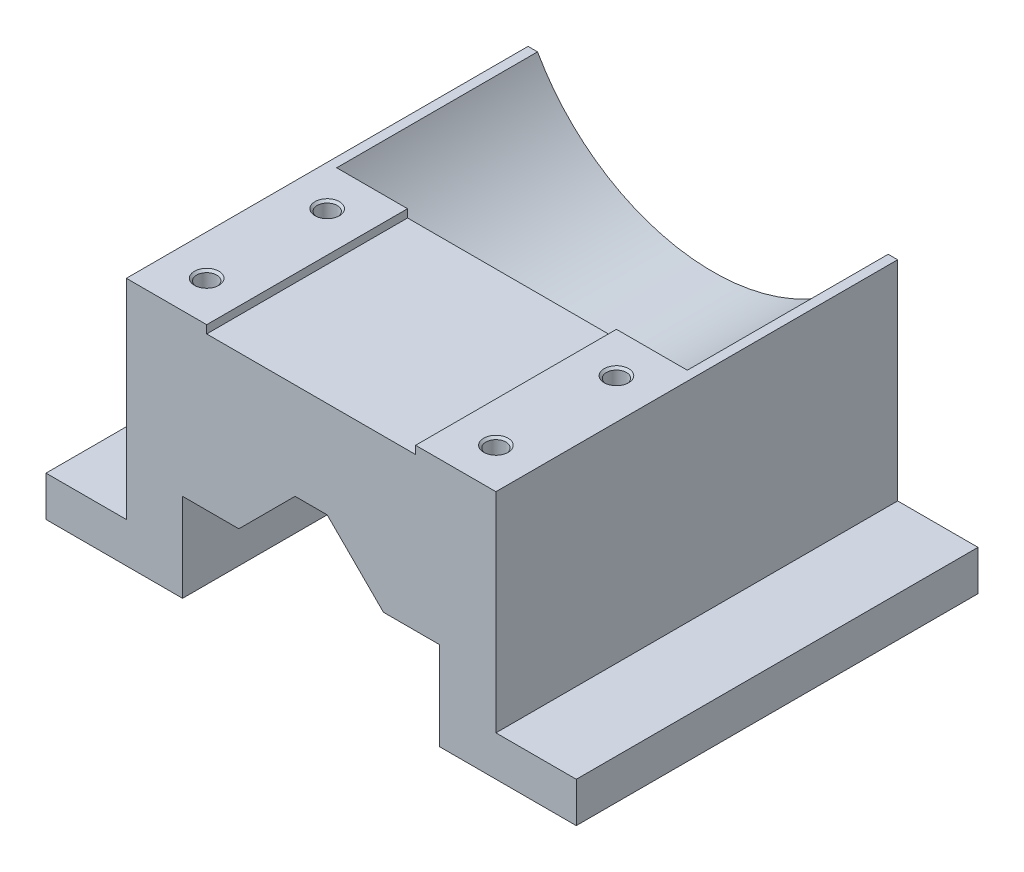
ISO-10303-21;
HEADER;
FILE_DESCRIPTION(('STEP AP214'),'2;1');
FILE_NAME('part.step','',(''),(''),'','','');
FILE_SCHEMA(('AUTOMOTIVE_DESIGN { 1 0 10303 214 1 1 1 1 }'));
ENDSEC;
DATA;
#1=APPLICATION_CONTEXT('core data for automotive mechanical design processes');
#2=APPLICATION_PROTOCOL_DEFINITION('international standard','automotive_design',2000,#1);
#3=PRODUCT_CONTEXT('',#1,'mechanical');
#4=PRODUCT('Part','Part','',(#3));
#5=PRODUCT_RELATED_PRODUCT_CATEGORY('part','',(#4));
#6=PRODUCT_DEFINITION_FORMATION('','',#4);
#7=PRODUCT_DEFINITION_CONTEXT('part definition',#1,'design');
#8=PRODUCT_DEFINITION('design','',#6,#7);
#9=PRODUCT_DEFINITION_SHAPE('','',#8);
#10=(LENGTH_UNIT() NAMED_UNIT(*) SI_UNIT(.MILLI.,.METRE.));
#11=(NAMED_UNIT(*) PLANE_ANGLE_UNIT() SI_UNIT($,.RADIAN.));
#12=(NAMED_UNIT(*) SI_UNIT($,.STERADIAN.) SOLID_ANGLE_UNIT());
#13=UNCERTAINTY_MEASURE_WITH_UNIT(LENGTH_MEASURE(1.E-05),#10,'distance_accuracy_value','');
#14=(GEOMETRIC_REPRESENTATION_CONTEXT(3) GLOBAL_UNCERTAINTY_ASSIGNED_CONTEXT((#13)) GLOBAL_UNIT_ASSIGNED_CONTEXT((#10,
#11,#12)) REPRESENTATION_CONTEXT('',''));
#15=CARTESIAN_POINT('',(0.,0.,0.));
#16=DIRECTION('',(0.,0.,1.));
#17=DIRECTION('',(1.,0.,0.));
#18=AXIS2_PLACEMENT_3D('',#15,#16,#17);
#19=CARTESIAN_POINT('',(-13.,0.,50.));
#20=DIRECTION('',(-1.,0.,0.));
#21=DIRECTION('',(0.,0.,1.));
#22=AXIS2_PLACEMENT_3D('',#19,#20,#21);
#23=PLANE('',#22);
#24=DIRECTION('',(0.,-1.,0.));
#25=VECTOR('',#24,1.);
#26=CARTESIAN_POINT('',(-13.,0.,25.));
#27=LINE('',#26,#25);
#28=CARTESIAN_POINT('',(-13.,1.,25.));
#29=VERTEX_POINT('',#28);
#30=CARTESIAN_POINT('',(-13.,0.,25.));
#31=VERTEX_POINT('',#30);
#32=EDGE_CURVE('E349',#29,#31,#27,.T.);
#33=ORIENTED_EDGE('',*,*,#32,.F.);
#34=DIRECTION('',(0.,0.,-1.));
#35=VECTOR('',#34,1.);
#36=CARTESIAN_POINT('',(-13.,1.,50.));
#37=LINE('',#36,#35);
#38=CARTESIAN_POINT('',(-13.,1.,50.));
#39=VERTEX_POINT('',#38);
#40=EDGE_CURVE('E53',#39,#29,#37,.T.);
#41=ORIENTED_EDGE('',*,*,#40,.F.);
#42=DIRECTION('',(0.,1.,0.));
#43=VECTOR('',#42,1.);
#44=CARTESIAN_POINT('',(-13.,0.,50.));
#45=LINE('',#44,#43);
#46=CARTESIAN_POINT('',(-13.,0.,50.));
#47=VERTEX_POINT('',#46);
#48=EDGE_CURVE('E272',#47,#39,#45,.T.);
#49=ORIENTED_EDGE('',*,*,#48,.F.);
#50=DIRECTION('',(0.,0.,-1.));
#51=VECTOR('',#50,1.);
#52=CARTESIAN_POINT('',(-13.,0.,50.));
#53=LINE('',#52,#51);
#54=EDGE_CURVE('E217',#47,#31,#53,.T.);
#55=ORIENTED_EDGE('',*,*,#54,.T.);
#56=EDGE_LOOP('',(#33,#41,#49,#55));
#57=FACE_BOUND('',#56,.T.);
#58=ADVANCED_FACE('F45',(#57),#23,.F.);
#59=CARTESIAN_POINT('',(13.,0.,50.));
#60=DIRECTION('',(1.,0.,0.));
#61=DIRECTION('',(0.,0.,-1.));
#62=AXIS2_PLACEMENT_3D('',#59,#60,#61);
#63=PLANE('',#62);
#64=DIRECTION('',(0.,1.,0.));
#65=VECTOR('',#64,1.);
#66=CARTESIAN_POINT('',(13.,0.,25.));
#67=LINE('',#66,#65);
#68=CARTESIAN_POINT('',(13.,0.,25.));
#69=VERTEX_POINT('',#68);
#70=CARTESIAN_POINT('',(13.,1.,25.));
#71=VERTEX_POINT('',#70);
#72=EDGE_CURVE('E358',#69,#71,#67,.T.);
#73=ORIENTED_EDGE('',*,*,#72,.F.);
#74=DIRECTION('',(0.,0.,-1.));
#75=VECTOR('',#74,1.);
#76=CARTESIAN_POINT('',(13.,0.,50.));
#77=LINE('',#76,#75);
#78=CARTESIAN_POINT('',(13.,0.,50.));
#79=VERTEX_POINT('',#78);
#80=EDGE_CURVE('E210',#79,#69,#77,.T.);
#81=ORIENTED_EDGE('',*,*,#80,.F.);
#82=DIRECTION('',(0.,-1.,0.));
#83=VECTOR('',#82,1.);
#84=CARTESIAN_POINT('',(13.,0.,50.));
#85=LINE('',#84,#83);
#86=CARTESIAN_POINT('',(13.,1.,50.));
#87=VERTEX_POINT('',#86);
#88=EDGE_CURVE('E191',#87,#79,#85,.T.);
#89=ORIENTED_EDGE('',*,*,#88,.F.);
#90=DIRECTION('',(0.,0.,-1.));
#91=VECTOR('',#90,1.);
#92=CARTESIAN_POINT('',(13.,1.,50.));
#93=LINE('',#92,#91);
#94=EDGE_CURVE('E200',#87,#71,#93,.T.);
#95=ORIENTED_EDGE('',*,*,#94,.T.);
#96=EDGE_LOOP('',(#73,#81,#89,#95));
#97=FACE_BOUND('',#96,.T.);
#98=ADVANCED_FACE('F212',(#97),#63,.F.);
#99=CARTESIAN_POINT('',(-13.,0.,50.));
#100=DIRECTION('',(0.,-1.,0.));
#101=DIRECTION('',(1.,0.,0.));
#102=AXIS2_PLACEMENT_3D('',#99,#100,#101);
#103=PLANE('',#102);
#104=DIRECTION('',(1.,0.,0.));
#105=VECTOR('',#104,1.);
#106=CARTESIAN_POINT('',(-13.,0.,25.));
#107=LINE('',#106,#105);
#108=EDGE_CURVE('E11',#31,#69,#107,.T.);
#109=ORIENTED_EDGE('',*,*,#108,.F.);
#110=ORIENTED_EDGE('',*,*,#54,.F.);
#111=DIRECTION('',(-1.,0.,0.));
#112=VECTOR('',#111,1.);
#113=CARTESIAN_POINT('',(-13.,0.,50.));
#114=LINE('',#113,#112);
#115=EDGE_CURVE('E69',#79,#47,#114,.T.);
#116=ORIENTED_EDGE('',*,*,#115,.F.);
#117=ORIENTED_EDGE('',*,*,#80,.T.);
#118=EDGE_LOOP('',(#109,#110,#116,#117));
#119=FACE_BOUND('',#118,.T.);
#120=ADVANCED_FACE('F447',(#119),#103,.F.);
#121=CARTESIAN_POINT('',(-13.,1.,50.));
#122=DIRECTION('',(0.,-1.,0.));
#123=DIRECTION('',(1.,0.,0.));
#124=AXIS2_PLACEMENT_3D('',#121,#122,#123);
#125=PLANE('',#124);
#126=CARTESIAN_POINT('',(-18.,1.,30.));
#127=DIRECTION('',(0.,1.,0.));
#128=DIRECTION('',(0.,0.,1.));
#129=AXIS2_PLACEMENT_3D('',#126,#127,#128);
#130=CIRCLE('',#129,1.525);
#131=CARTESIAN_POINT('',(-18.,1.,31.525));
#132=VERTEX_POINT('',#131);
#133=EDGE_CURVE('E485',#132,#132,#130,.T.);
#134=ORIENTED_EDGE('',*,*,#133,.F.);
#135=EDGE_LOOP('',(#134));
#136=FACE_BOUND('',#135,.T.);
#137=CARTESIAN_POINT('',(-18.,1.,45.));
#138=DIRECTION('',(0.,1.,0.));
#139=DIRECTION('',(0.,0.,1.));
#140=AXIS2_PLACEMENT_3D('',#137,#138,#139);
#141=CIRCLE('',#140,1.525);
#142=CARTESIAN_POINT('',(-18.,1.,46.525));
#143=VERTEX_POINT('',#142);
#144=EDGE_CURVE('E476',#143,#143,#141,.T.);
#145=ORIENTED_EDGE('',*,*,#144,.F.);
#146=EDGE_LOOP('',(#145));
#147=FACE_BOUND('',#146,.T.);
#148=DIRECTION('',(1.,0.,0.));
#149=VECTOR('',#148,1.);
#150=CARTESIAN_POINT('',(-13.,1.,25.));
#151=LINE('',#150,#149);
#152=CARTESIAN_POINT('',(-21.8210907151774,0.999999999999999,25.));
#153=VERTEX_POINT('',#152);
#154=EDGE_CURVE('E225',#153,#29,#151,.T.);
#155=ORIENTED_EDGE('',*,*,#154,.F.);
#156=DIRECTION('',(0.,0.,-1.));
#157=VECTOR('',#156,1.);
#158=CARTESIAN_POINT('',(-21.8210907151774,0.999999999999999,25.));
#159=LINE('',#158,#157);
#160=CARTESIAN_POINT('',(-21.8210907151774,0.999999999999999,0.));
#161=VERTEX_POINT('',#160);
#162=EDGE_CURVE('E438',#153,#161,#159,.T.);
#163=ORIENTED_EDGE('',*,*,#162,.T.);
#164=DIRECTION('',(-1.,0.,0.));
#165=VECTOR('',#164,1.);
#166=CARTESIAN_POINT('',(-13.,1.,0.));
#167=LINE('',#166,#165);
#168=CARTESIAN_POINT('',(-23.,0.999999999999999,0.));
#169=VERTEX_POINT('',#168);
#170=EDGE_CURVE('E221',#161,#169,#167,.T.);
#171=ORIENTED_EDGE('',*,*,#170,.T.);
#172=DIRECTION('',(0.,0.,-1.));
#173=VECTOR('',#172,1.);
#174=CARTESIAN_POINT('',(-23.,0.999999999999999,50.));
#175=LINE('',#174,#173);
#176=CARTESIAN_POINT('',(-23.,0.999999999999999,50.));
#177=VERTEX_POINT('',#176);
#178=EDGE_CURVE('E335',#177,#169,#175,.T.);
#179=ORIENTED_EDGE('',*,*,#178,.F.);
#180=DIRECTION('',(-1.,0.,0.));
#181=VECTOR('',#180,1.);
#182=CARTESIAN_POINT('',(-13.,1.,50.));
#183=LINE('',#182,#181);
#184=EDGE_CURVE('E136',#39,#177,#183,.T.);
#185=ORIENTED_EDGE('',*,*,#184,.F.);
#186=ORIENTED_EDGE('',*,*,#40,.T.);
#187=EDGE_LOOP('',(#155,#163,#171,#179,#185,#186));
#188=FACE_BOUND('',#187,.T.);
#189=ADVANCED_FACE('F341',(#136,#147,#188),#125,.F.);
#190=CARTESIAN_POINT('',(-23.,0.999999999999999,50.));
#191=DIRECTION('',(1.,0.,0.));
#192=DIRECTION('',(0.,1.,0.));
#193=AXIS2_PLACEMENT_3D('',#190,#191,#192);
#194=PLANE('',#193);
#195=DIRECTION('',(0.,-1.,0.));
#196=VECTOR('',#195,1.);
#197=CARTESIAN_POINT('',(-23.,0.999999999999999,0.));
#198=LINE('',#197,#196);
#199=CARTESIAN_POINT('',(-23.,-25.,0.));
#200=VERTEX_POINT('',#199);
#201=EDGE_CURVE('E224',#169,#200,#198,.T.);
#202=ORIENTED_EDGE('',*,*,#201,.T.);
#203=DIRECTION('',(0.,0.,-1.));
#204=VECTOR('',#203,1.);
#205=CARTESIAN_POINT('',(-23.,-25.,50.));
#206=LINE('',#205,#204);
#207=CARTESIAN_POINT('',(-23.,-25.,50.));
#208=VERTEX_POINT('',#207);
#209=EDGE_CURVE('E331',#208,#200,#206,.T.);
#210=ORIENTED_EDGE('',*,*,#209,.F.);
#211=DIRECTION('',(0.,-1.,0.));
#212=VECTOR('',#211,1.);
#213=CARTESIAN_POINT('',(-23.,0.999999999999999,50.));
#214=LINE('',#213,#212);
#215=EDGE_CURVE('E366',#177,#208,#214,.T.);
#216=ORIENTED_EDGE('',*,*,#215,.F.);
#217=ORIENTED_EDGE('',*,*,#178,.T.);
#218=EDGE_LOOP('',(#202,#210,#216,#217));
#219=FACE_BOUND('',#218,.T.);
#220=ADVANCED_FACE('F596',(#219),#194,.F.);
#221=CARTESIAN_POINT('',(-23.,-25.,50.));
#222=DIRECTION('',(0.,-1.,0.));
#223=DIRECTION('',(0.,0.,-1.));
#224=AXIS2_PLACEMENT_3D('',#221,#222,#223);
#225=PLANE('',#224);
#226=DIRECTION('',(-1.,0.,0.));
#227=VECTOR('',#226,1.);
#228=CARTESIAN_POINT('',(-23.,-25.,0.));
#229=LINE('',#228,#227);
#230=CARTESIAN_POINT('',(-33.,-25.,0.));
#231=VERTEX_POINT('',#230);
#232=EDGE_CURVE('E228',#200,#231,#229,.T.);
#233=ORIENTED_EDGE('',*,*,#232,.T.);
#234=DIRECTION('',(0.,0.,-1.));
#235=VECTOR('',#234,1.);
#236=CARTESIAN_POINT('',(-33.,-25.,50.));
#237=LINE('',#236,#235);
#238=CARTESIAN_POINT('',(-33.,-25.,50.));
#239=VERTEX_POINT('',#238);
#240=EDGE_CURVE('E327',#239,#231,#237,.T.);
#241=ORIENTED_EDGE('',*,*,#240,.F.);
#242=DIRECTION('',(-1.,0.,0.));
#243=VECTOR('',#242,1.);
#244=CARTESIAN_POINT('',(-23.,-25.,50.));
#245=LINE('',#244,#243);
#246=EDGE_CURVE('E369',#208,#239,#245,.T.);
#247=ORIENTED_EDGE('',*,*,#246,.F.);
#248=ORIENTED_EDGE('',*,*,#209,.T.);
#249=EDGE_LOOP('',(#233,#241,#247,#248));
#250=FACE_BOUND('',#249,.T.);
#251=ADVANCED_FACE('F602',(#250),#225,.F.);
#252=CARTESIAN_POINT('',(-33.,-25.,50.));
#253=DIRECTION('',(1.,0.,0.));
#254=DIRECTION('',(0.,1.,0.));
#255=AXIS2_PLACEMENT_3D('',#252,#253,#254);
#256=PLANE('',#255);
#257=DIRECTION('',(0.,-1.,0.));
#258=VECTOR('',#257,1.);
#259=CARTESIAN_POINT('',(-33.,-25.,0.));
#260=LINE('',#259,#258);
#261=CARTESIAN_POINT('',(-33.,-30.,0.));
#262=VERTEX_POINT('',#261);
#263=EDGE_CURVE('E231',#231,#262,#260,.T.);
#264=ORIENTED_EDGE('',*,*,#263,.T.);
#265=DIRECTION('',(0.,0.,-1.));
#266=VECTOR('',#265,1.);
#267=CARTESIAN_POINT('',(-33.,-30.,50.));
#268=LINE('',#267,#266);
#269=CARTESIAN_POINT('',(-33.,-30.,50.));
#270=VERTEX_POINT('',#269);
#271=EDGE_CURVE('E323',#270,#262,#268,.T.);
#272=ORIENTED_EDGE('',*,*,#271,.F.);
#273=DIRECTION('',(0.,-1.,0.));
#274=VECTOR('',#273,1.);
#275=CARTESIAN_POINT('',(-33.,-25.,50.));
#276=LINE('',#275,#274);
#277=EDGE_CURVE('E372',#239,#270,#276,.T.);
#278=ORIENTED_EDGE('',*,*,#277,.F.);
#279=ORIENTED_EDGE('',*,*,#240,.T.);
#280=EDGE_LOOP('',(#264,#272,#278,#279));
#281=FACE_BOUND('',#280,.T.);
#282=ADVANCED_FACE('F608',(#281),#256,.F.);
#283=CARTESIAN_POINT('',(-33.,-30.,50.));
#284=DIRECTION('',(0.,1.,0.));
#285=DIRECTION('',(0.,0.,1.));
#286=AXIS2_PLACEMENT_3D('',#283,#284,#285);
#287=PLANE('',#286);
#288=DIRECTION('',(1.,0.,0.));
#289=VECTOR('',#288,1.);
#290=CARTESIAN_POINT('',(-33.,-30.,0.));
#291=LINE('',#290,#289);
#292=CARTESIAN_POINT('',(-16.,-30.,0.));
#293=VERTEX_POINT('',#292);
#294=EDGE_CURVE('E234',#262,#293,#291,.T.);
#295=ORIENTED_EDGE('',*,*,#294,.T.);
#296=DIRECTION('',(0.,0.,-1.));
#297=VECTOR('',#296,1.);
#298=CARTESIAN_POINT('',(-16.,-30.,50.));
#299=LINE('',#298,#297);
#300=CARTESIAN_POINT('',(-16.,-30.,50.));
#301=VERTEX_POINT('',#300);
#302=EDGE_CURVE('E319',#301,#293,#299,.T.);
#303=ORIENTED_EDGE('',*,*,#302,.F.);
#304=DIRECTION('',(1.,0.,0.));
#305=VECTOR('',#304,1.);
#306=CARTESIAN_POINT('',(-33.,-30.,50.));
#307=LINE('',#306,#305);
#308=EDGE_CURVE('E375',#270,#301,#307,.T.);
#309=ORIENTED_EDGE('',*,*,#308,.F.);
#310=ORIENTED_EDGE('',*,*,#271,.T.);
#311=EDGE_LOOP('',(#295,#303,#309,#310));
#312=FACE_BOUND('',#311,.T.);
#313=ADVANCED_FACE('F612',(#312),#287,.F.);
#314=CARTESIAN_POINT('',(-16.,-30.,50.));
#315=DIRECTION('',(-1.,0.,0.));
#316=DIRECTION('',(0.,0.,1.));
#317=AXIS2_PLACEMENT_3D('',#314,#315,#316);
#318=PLANE('',#317);
#319=DIRECTION('',(0.,1.,0.));
#320=VECTOR('',#319,1.);
#321=CARTESIAN_POINT('',(-16.,-30.,0.));
#322=LINE('',#321,#320);
#323=CARTESIAN_POINT('',(-16.,-19.,0.));
#324=VERTEX_POINT('',#323);
#325=EDGE_CURVE('E237',#293,#324,#322,.T.);
#326=ORIENTED_EDGE('',*,*,#325,.T.);
#327=DIRECTION('',(0.,0.,-1.));
#328=VECTOR('',#327,1.);
#329=CARTESIAN_POINT('',(-16.,-19.,50.));
#330=LINE('',#329,#328);
#331=CARTESIAN_POINT('',(-16.,-19.,50.));
#332=VERTEX_POINT('',#331);
#333=EDGE_CURVE('E315',#332,#324,#330,.T.);
#334=ORIENTED_EDGE('',*,*,#333,.F.);
#335=DIRECTION('',(0.,1.,0.));
#336=VECTOR('',#335,1.);
#337=CARTESIAN_POINT('',(-16.,-30.,50.));
#338=LINE('',#337,#336);
#339=EDGE_CURVE('E378',#301,#332,#338,.T.);
#340=ORIENTED_EDGE('',*,*,#339,.F.);
#341=ORIENTED_EDGE('',*,*,#302,.T.);
#342=EDGE_LOOP('',(#326,#334,#340,#341));
#343=FACE_BOUND('',#342,.T.);
#344=ADVANCED_FACE('F616',(#343),#318,.F.);
#345=CARTESIAN_POINT('',(-16.,-19.,50.));
#346=DIRECTION('',(0.,1.,0.));
#347=DIRECTION('',(0.,0.,1.));
#348=AXIS2_PLACEMENT_3D('',#345,#346,#347);
#349=PLANE('',#348);
#350=DIRECTION('',(1.,0.,0.));
#351=VECTOR('',#350,1.);
#352=CARTESIAN_POINT('',(-16.,-19.,0.));
#353=LINE('',#352,#351);
#354=CARTESIAN_POINT('',(-9.00000000000002,-19.,0.));
#355=VERTEX_POINT('',#354);
#356=EDGE_CURVE('E240',#324,#355,#353,.T.);
#357=ORIENTED_EDGE('',*,*,#356,.T.);
#358=DIRECTION('',(0.,0.,-1.));
#359=VECTOR('',#358,1.);
#360=CARTESIAN_POINT('',(-9.00000000000002,-19.,50.));
#361=LINE('',#360,#359);
#362=CARTESIAN_POINT('',(-9.00000000000002,-19.,50.));
#363=VERTEX_POINT('',#362);
#364=EDGE_CURVE('E311',#363,#355,#361,.T.);
#365=ORIENTED_EDGE('',*,*,#364,.F.);
#366=DIRECTION('',(1.,0.,0.));
#367=VECTOR('',#366,1.);
#368=CARTESIAN_POINT('',(-16.,-19.,50.));
#369=LINE('',#368,#367);
#370=EDGE_CURVE('E381',#332,#363,#369,.T.);
#371=ORIENTED_EDGE('',*,*,#370,.F.);
#372=ORIENTED_EDGE('',*,*,#333,.T.);
#373=EDGE_LOOP('',(#357,#365,#371,#372));
#374=FACE_BOUND('',#373,.T.);
#375=ADVANCED_FACE('F620',(#374),#349,.F.);
#376=CARTESIAN_POINT('',(-2.,-12.,50.));
#377=DIRECTION('',(-0.707106781186546,0.707106781186549,0.));
#378=DIRECTION('',(-0.707106781186549,-0.707106781186546,0.));
#379=AXIS2_PLACEMENT_3D('',#376,#377,#378);
#380=PLANE('',#379);
#381=DIRECTION('',(0.707106781186549,0.707106781186546,0.));
#382=VECTOR('',#381,1.);
#383=CARTESIAN_POINT('',(-2.,-12.,0.));
#384=LINE('',#383,#382);
#385=CARTESIAN_POINT('',(-2.,-12.,0.));
#386=VERTEX_POINT('',#385);
#387=EDGE_CURVE('E243',#355,#386,#384,.T.);
#388=ORIENTED_EDGE('',*,*,#387,.T.);
#389=DIRECTION('',(0.,0.,-1.));
#390=VECTOR('',#389,1.);
#391=CARTESIAN_POINT('',(-2.,-12.,50.));
#392=LINE('',#391,#390);
#393=CARTESIAN_POINT('',(-2.,-12.,50.));
#394=VERTEX_POINT('',#393);
#395=EDGE_CURVE('E307',#394,#386,#392,.T.);
#396=ORIENTED_EDGE('',*,*,#395,.F.);
#397=DIRECTION('',(0.707106781186549,0.707106781186546,0.));
#398=VECTOR('',#397,1.);
#399=CARTESIAN_POINT('',(-2.,-12.,50.));
#400=LINE('',#399,#398);
#401=EDGE_CURVE('E384',#363,#394,#400,.T.);
#402=ORIENTED_EDGE('',*,*,#401,.F.);
#403=ORIENTED_EDGE('',*,*,#364,.T.);
#404=EDGE_LOOP('',(#388,#396,#402,#403));
#405=FACE_BOUND('',#404,.T.);
#406=ADVANCED_FACE('F624',(#405),#380,.F.);
#407=CARTESIAN_POINT('',(2.,-12.,50.));
#408=DIRECTION('',(0.,1.,0.));
#409=DIRECTION('',(0.,0.,1.));
#410=AXIS2_PLACEMENT_3D('',#407,#408,#409);
#411=PLANE('',#410);
#412=DIRECTION('',(1.,0.,0.));
#413=VECTOR('',#412,1.);
#414=CARTESIAN_POINT('',(2.,-12.,0.));
#415=LINE('',#414,#413);
#416=CARTESIAN_POINT('',(2.,-12.,0.));
#417=VERTEX_POINT('',#416);
#418=EDGE_CURVE('E246',#386,#417,#415,.T.);
#419=ORIENTED_EDGE('',*,*,#418,.T.);
#420=DIRECTION('',(0.,0.,-1.));
#421=VECTOR('',#420,1.);
#422=CARTESIAN_POINT('',(2.,-12.,50.));
#423=LINE('',#422,#421);
#424=CARTESIAN_POINT('',(2.,-12.,50.));
#425=VERTEX_POINT('',#424);
#426=EDGE_CURVE('E303',#425,#417,#423,.T.);
#427=ORIENTED_EDGE('',*,*,#426,.F.);
#428=DIRECTION('',(1.,0.,0.));
#429=VECTOR('',#428,1.);
#430=CARTESIAN_POINT('',(2.,-12.,50.));
#431=LINE('',#430,#429);
#432=EDGE_CURVE('E387',#394,#425,#431,.T.);
#433=ORIENTED_EDGE('',*,*,#432,.F.);
#434=ORIENTED_EDGE('',*,*,#395,.T.);
#435=EDGE_LOOP('',(#419,#427,#433,#434));
#436=FACE_BOUND('',#435,.T.);
#437=ADVANCED_FACE('F628',(#436),#411,.F.);
#438=CARTESIAN_POINT('',(2.,-12.,50.));
#439=DIRECTION('',(0.707106781186546,0.707106781186549,0.));
#440=DIRECTION('',(-0.707106781186549,0.707106781186546,0.));
#441=AXIS2_PLACEMENT_3D('',#438,#439,#440);
#442=PLANE('',#441);
#443=DIRECTION('',(0.707106781186549,-0.707106781186546,0.));
#444=VECTOR('',#443,1.);
#445=CARTESIAN_POINT('',(2.,-12.,0.));
#446=LINE('',#445,#444);
#447=CARTESIAN_POINT('',(9.00000000000002,-19.,0.));
#448=VERTEX_POINT('',#447);
#449=EDGE_CURVE('E249',#417,#448,#446,.T.);
#450=ORIENTED_EDGE('',*,*,#449,.T.);
#451=DIRECTION('',(0.,0.,-1.));
#452=VECTOR('',#451,1.);
#453=CARTESIAN_POINT('',(9.00000000000002,-19.,50.));
#454=LINE('',#453,#452);
#455=CARTESIAN_POINT('',(9.00000000000002,-19.,50.));
#456=VERTEX_POINT('',#455);
#457=EDGE_CURVE('E299',#456,#448,#454,.T.);
#458=ORIENTED_EDGE('',*,*,#457,.F.);
#459=DIRECTION('',(0.707106781186549,-0.707106781186546,0.));
#460=VECTOR('',#459,1.);
#461=CARTESIAN_POINT('',(2.,-12.,50.));
#462=LINE('',#461,#460);
#463=EDGE_CURVE('E390',#425,#456,#462,.T.);
#464=ORIENTED_EDGE('',*,*,#463,.F.);
#465=ORIENTED_EDGE('',*,*,#426,.T.);
#466=EDGE_LOOP('',(#450,#458,#464,#465));
#467=FACE_BOUND('',#466,.T.);
#468=ADVANCED_FACE('F632',(#467),#442,.F.);
#469=CARTESIAN_POINT('',(16.,-19.,50.));
#470=DIRECTION('',(0.,1.,0.));
#471=DIRECTION('',(0.,0.,1.));
#472=AXIS2_PLACEMENT_3D('',#469,#470,#471);
#473=PLANE('',#472);
#474=DIRECTION('',(1.,0.,0.));
#475=VECTOR('',#474,1.);
#476=CARTESIAN_POINT('',(16.,-19.,0.));
#477=LINE('',#476,#475);
#478=CARTESIAN_POINT('',(16.,-19.,0.));
#479=VERTEX_POINT('',#478);
#480=EDGE_CURVE('E252',#448,#479,#477,.T.);
#481=ORIENTED_EDGE('',*,*,#480,.T.);
#482=DIRECTION('',(0.,0.,-1.));
#483=VECTOR('',#482,1.);
#484=CARTESIAN_POINT('',(16.,-19.,50.));
#485=LINE('',#484,#483);
#486=CARTESIAN_POINT('',(16.,-19.,50.));
#487=VERTEX_POINT('',#486);
#488=EDGE_CURVE('E295',#487,#479,#485,.T.);
#489=ORIENTED_EDGE('',*,*,#488,.F.);
#490=DIRECTION('',(1.,0.,0.));
#491=VECTOR('',#490,1.);
#492=CARTESIAN_POINT('',(16.,-19.,50.));
#493=LINE('',#492,#491);
#494=EDGE_CURVE('E393',#456,#487,#493,.T.);
#495=ORIENTED_EDGE('',*,*,#494,.F.);
#496=ORIENTED_EDGE('',*,*,#457,.T.);
#497=EDGE_LOOP('',(#481,#489,#495,#496));
#498=FACE_BOUND('',#497,.T.);
#499=ADVANCED_FACE('F636',(#498),#473,.F.);
#500=CARTESIAN_POINT('',(16.,-30.,50.));
#501=DIRECTION('',(1.,0.,0.));
#502=DIRECTION('',(0.,0.,-1.));
#503=AXIS2_PLACEMENT_3D('',#500,#501,#502);
#504=PLANE('',#503);
#505=DIRECTION('',(0.,-1.,0.));
#506=VECTOR('',#505,1.);
#507=CARTESIAN_POINT('',(16.,-30.,0.));
#508=LINE('',#507,#506);
#509=CARTESIAN_POINT('',(16.,-30.,0.));
#510=VERTEX_POINT('',#509);
#511=EDGE_CURVE('E255',#479,#510,#508,.T.);
#512=ORIENTED_EDGE('',*,*,#511,.T.);
#513=DIRECTION('',(0.,0.,-1.));
#514=VECTOR('',#513,1.);
#515=CARTESIAN_POINT('',(16.,-30.,50.));
#516=LINE('',#515,#514);
#517=CARTESIAN_POINT('',(16.,-30.,50.));
#518=VERTEX_POINT('',#517);
#519=EDGE_CURVE('E291',#518,#510,#516,.T.);
#520=ORIENTED_EDGE('',*,*,#519,.F.);
#521=DIRECTION('',(0.,-1.,0.));
#522=VECTOR('',#521,1.);
#523=CARTESIAN_POINT('',(16.,-30.,50.));
#524=LINE('',#523,#522);
#525=EDGE_CURVE('E396',#487,#518,#524,.T.);
#526=ORIENTED_EDGE('',*,*,#525,.F.);
#527=ORIENTED_EDGE('',*,*,#488,.T.);
#528=EDGE_LOOP('',(#512,#520,#526,#527));
#529=FACE_BOUND('',#528,.T.);
#530=ADVANCED_FACE('F640',(#529),#504,.F.);
#531=CARTESIAN_POINT('',(33.,-30.,50.));
#532=DIRECTION('',(0.,1.,0.));
#533=DIRECTION('',(-1.,0.,0.));
#534=AXIS2_PLACEMENT_3D('',#531,#532,#533);
#535=PLANE('',#534);
#536=DIRECTION('',(1.,0.,0.));
#537=VECTOR('',#536,1.);
#538=CARTESIAN_POINT('',(33.,-30.,0.));
#539=LINE('',#538,#537);
#540=CARTESIAN_POINT('',(33.,-30.,0.));
#541=VERTEX_POINT('',#540);
#542=EDGE_CURVE('E258',#510,#541,#539,.T.);
#543=ORIENTED_EDGE('',*,*,#542,.T.);
#544=DIRECTION('',(0.,0.,-1.));
#545=VECTOR('',#544,1.);
#546=CARTESIAN_POINT('',(33.,-30.,50.));
#547=LINE('',#546,#545);
#548=CARTESIAN_POINT('',(33.,-30.,50.));
#549=VERTEX_POINT('',#548);
#550=EDGE_CURVE('E287',#549,#541,#547,.T.);
#551=ORIENTED_EDGE('',*,*,#550,.F.);
#552=DIRECTION('',(1.,0.,0.));
#553=VECTOR('',#552,1.);
#554=CARTESIAN_POINT('',(33.,-30.,50.));
#555=LINE('',#554,#553);
#556=EDGE_CURVE('E399',#518,#549,#555,.T.);
#557=ORIENTED_EDGE('',*,*,#556,.F.);
#558=ORIENTED_EDGE('',*,*,#519,.T.);
#559=EDGE_LOOP('',(#543,#551,#557,#558));
#560=FACE_BOUND('',#559,.T.);
#561=ADVANCED_FACE('F644',(#560),#535,.F.);
#562=CARTESIAN_POINT('',(33.,-25.,50.));
#563=DIRECTION('',(-1.,0.,0.));
#564=DIRECTION('',(0.,-1.,0.));
#565=AXIS2_PLACEMENT_3D('',#562,#563,#564);
#566=PLANE('',#565);
#567=DIRECTION('',(0.,1.,0.));
#568=VECTOR('',#567,1.);
#569=CARTESIAN_POINT('',(33.,-25.,0.));
#570=LINE('',#569,#568);
#571=CARTESIAN_POINT('',(33.,-25.,0.));
#572=VERTEX_POINT('',#571);
#573=EDGE_CURVE('E261',#541,#572,#570,.T.);
#574=ORIENTED_EDGE('',*,*,#573,.T.);
#575=DIRECTION('',(0.,0.,-1.));
#576=VECTOR('',#575,1.);
#577=CARTESIAN_POINT('',(33.,-25.,50.));
#578=LINE('',#577,#576);
#579=CARTESIAN_POINT('',(33.,-25.,50.));
#580=VERTEX_POINT('',#579);
#581=EDGE_CURVE('E283',#580,#572,#578,.T.);
#582=ORIENTED_EDGE('',*,*,#581,.F.);
#583=DIRECTION('',(0.,1.,0.));
#584=VECTOR('',#583,1.);
#585=CARTESIAN_POINT('',(33.,-25.,50.));
#586=LINE('',#585,#584);
#587=EDGE_CURVE('E402',#549,#580,#586,.T.);
#588=ORIENTED_EDGE('',*,*,#587,.F.);
#589=ORIENTED_EDGE('',*,*,#550,.T.);
#590=EDGE_LOOP('',(#574,#582,#588,#589));
#591=FACE_BOUND('',#590,.T.);
#592=ADVANCED_FACE('F648',(#591),#566,.F.);
#593=CARTESIAN_POINT('',(23.,-25.,50.));
#594=DIRECTION('',(0.,-1.,0.));
#595=DIRECTION('',(0.,0.,-1.));
#596=AXIS2_PLACEMENT_3D('',#593,#594,#595);
#597=PLANE('',#596);
#598=DIRECTION('',(-1.,0.,0.));
#599=VECTOR('',#598,1.);
#600=CARTESIAN_POINT('',(23.,-25.,0.));
#601=LINE('',#600,#599);
#602=CARTESIAN_POINT('',(23.,-25.,0.));
#603=VERTEX_POINT('',#602);
#604=EDGE_CURVE('E264',#572,#603,#601,.T.);
#605=ORIENTED_EDGE('',*,*,#604,.T.);
#606=DIRECTION('',(0.,0.,-1.));
#607=VECTOR('',#606,1.);
#608=CARTESIAN_POINT('',(23.,-25.,50.));
#609=LINE('',#608,#607);
#610=CARTESIAN_POINT('',(23.,-25.,50.));
#611=VERTEX_POINT('',#610);
#612=EDGE_CURVE('E280',#611,#603,#609,.T.);
#613=ORIENTED_EDGE('',*,*,#612,.F.);
#614=DIRECTION('',(-1.,0.,0.));
#615=VECTOR('',#614,1.);
#616=CARTESIAN_POINT('',(23.,-25.,50.));
#617=LINE('',#616,#615);
#618=EDGE_CURVE('E405',#580,#611,#617,.T.);
#619=ORIENTED_EDGE('',*,*,#618,.F.);
#620=ORIENTED_EDGE('',*,*,#581,.T.);
#621=EDGE_LOOP('',(#605,#613,#619,#620));
#622=FACE_BOUND('',#621,.T.);
#623=ADVANCED_FACE('F413',(#622),#597,.F.);
#624=CARTESIAN_POINT('',(23.,1.,50.));
#625=DIRECTION('',(-1.,0.,0.));
#626=DIRECTION('',(0.,-1.,0.));
#627=AXIS2_PLACEMENT_3D('',#624,#625,#626);
#628=PLANE('',#627);
#629=DIRECTION('',(0.,1.,0.));
#630=VECTOR('',#629,1.);
#631=CARTESIAN_POINT('',(23.,1.,0.));
#632=LINE('',#631,#630);
#633=CARTESIAN_POINT('',(23.,1.,0.));
#634=VERTEX_POINT('',#633);
#635=EDGE_CURVE('E127',#603,#634,#632,.T.);
#636=ORIENTED_EDGE('',*,*,#635,.T.);
#637=DIRECTION('',(0.,0.,-1.));
#638=VECTOR('',#637,1.);
#639=CARTESIAN_POINT('',(23.,1.,50.));
#640=LINE('',#639,#638);
#641=CARTESIAN_POINT('',(23.,1.,50.));
#642=VERTEX_POINT('',#641);
#643=EDGE_CURVE('E209',#642,#634,#640,.T.);
#644=ORIENTED_EDGE('',*,*,#643,.F.);
#645=DIRECTION('',(0.,1.,0.));
#646=VECTOR('',#645,1.);
#647=CARTESIAN_POINT('',(23.,1.,50.));
#648=LINE('',#647,#646);
#649=EDGE_CURVE('E194',#611,#642,#648,.T.);
#650=ORIENTED_EDGE('',*,*,#649,.F.);
#651=ORIENTED_EDGE('',*,*,#612,.T.);
#652=EDGE_LOOP('',(#636,#644,#650,#651));
#653=FACE_BOUND('',#652,.T.);
#654=ADVANCED_FACE('F415',(#653),#628,.F.);
#655=CARTESIAN_POINT('',(13.,1.,50.));
#656=DIRECTION('',(0.,-1.,0.));
#657=DIRECTION('',(1.,0.,0.));
#658=AXIS2_PLACEMENT_3D('',#655,#656,#657);
#659=PLANE('',#658);
#660=CARTESIAN_POINT('',(18.,1.00000000000001,30.));
#661=DIRECTION('',(0.,1.,0.));
#662=DIRECTION('',(0.,0.,1.));
#663=AXIS2_PLACEMENT_3D('',#660,#661,#662);
#664=CIRCLE('',#663,1.525);
#665=CARTESIAN_POINT('',(18.,1.00000000000001,31.525));
#666=VERTEX_POINT('',#665);
#667=EDGE_CURVE('E496',#666,#666,#664,.T.);
#668=ORIENTED_EDGE('',*,*,#667,.F.);
#669=EDGE_LOOP('',(#668));
#670=FACE_BOUND('',#669,.T.);
#671=CARTESIAN_POINT('',(18.,1.00000000000001,45.));
#672=DIRECTION('',(0.,1.,0.));
#673=DIRECTION('',(0.,0.,1.));
#674=AXIS2_PLACEMENT_3D('',#671,#672,#673);
#675=CIRCLE('',#674,1.525);
#676=CARTESIAN_POINT('',(18.,1.00000000000001,46.525));
#677=VERTEX_POINT('',#676);
#678=EDGE_CURVE('E508',#677,#677,#675,.T.);
#679=ORIENTED_EDGE('',*,*,#678,.F.);
#680=EDGE_LOOP('',(#679));
#681=FACE_BOUND('',#680,.T.);
#682=DIRECTION('',(-1.,0.,0.));
#683=VECTOR('',#682,1.);
#684=CARTESIAN_POINT('',(13.,1.,0.));
#685=LINE('',#684,#683);
#686=CARTESIAN_POINT('',(21.8210907151774,1.,0.));
#687=VERTEX_POINT('',#686);
#688=EDGE_CURVE('E269',#634,#687,#685,.T.);
#689=ORIENTED_EDGE('',*,*,#688,.T.);
#690=DIRECTION('',(0.,0.,-1.));
#691=VECTOR('',#690,1.);
#692=CARTESIAN_POINT('',(21.8210907151774,1.,25.));
#693=LINE('',#692,#691);
#694=CARTESIAN_POINT('',(21.8210907151774,1.,25.));
#695=VERTEX_POINT('',#694);
#696=EDGE_CURVE('E60',#687,#695,#693,.F.);
#697=ORIENTED_EDGE('',*,*,#696,.T.);
#698=DIRECTION('',(1.,0.,0.));
#699=VECTOR('',#698,1.);
#700=CARTESIAN_POINT('',(13.,1.,25.));
#701=LINE('',#700,#699);
#702=EDGE_CURVE('E205',#71,#695,#701,.T.);
#703=ORIENTED_EDGE('',*,*,#702,.F.);
#704=ORIENTED_EDGE('',*,*,#94,.F.);
#705=DIRECTION('',(-1.,0.,0.));
#706=VECTOR('',#705,1.);
#707=CARTESIAN_POINT('',(13.,1.,50.));
#708=LINE('',#707,#706);
#709=EDGE_CURVE('E187',#642,#87,#708,.T.);
#710=ORIENTED_EDGE('',*,*,#709,.F.);
#711=ORIENTED_EDGE('',*,*,#643,.T.);
#712=EDGE_LOOP('',(#689,#697,#703,#704,#710,#711));
#713=FACE_BOUND('',#712,.T.);
#714=ADVANCED_FACE('F202',(#670,#681,#713),#659,.F.);
#715=CARTESIAN_POINT('',(0.,0.,50.));
#716=DIRECTION('',(0.,0.,1.));
#717=DIRECTION('',(1.,0.,0.));
#718=AXIS2_PLACEMENT_3D('',#715,#716,#717);
#719=PLANE('',#718);
#720=ORIENTED_EDGE('',*,*,#48,.T.);
#721=ORIENTED_EDGE('',*,*,#184,.T.);
#722=ORIENTED_EDGE('',*,*,#215,.T.);
#723=ORIENTED_EDGE('',*,*,#246,.T.);
#724=ORIENTED_EDGE('',*,*,#277,.T.);
#725=ORIENTED_EDGE('',*,*,#308,.T.);
#726=ORIENTED_EDGE('',*,*,#339,.T.);
#727=ORIENTED_EDGE('',*,*,#370,.T.);
#728=ORIENTED_EDGE('',*,*,#401,.T.);
#729=ORIENTED_EDGE('',*,*,#432,.T.);
#730=ORIENTED_EDGE('',*,*,#463,.T.);
#731=ORIENTED_EDGE('',*,*,#494,.T.);
#732=ORIENTED_EDGE('',*,*,#525,.T.);
#733=ORIENTED_EDGE('',*,*,#556,.T.);
#734=ORIENTED_EDGE('',*,*,#587,.T.);
#735=ORIENTED_EDGE('',*,*,#618,.T.);
#736=ORIENTED_EDGE('',*,*,#649,.T.);
#737=ORIENTED_EDGE('',*,*,#709,.T.);
#738=ORIENTED_EDGE('',*,*,#88,.T.);
#739=ORIENTED_EDGE('',*,*,#115,.T.);
#740=EDGE_LOOP('',(#720,#721,#722,#723,#724,#725,#726,#727,#728,#729,#730,#731,#732,#733,#734,
#735,#736,#737,#738,#739));
#741=FACE_BOUND('',#740,.T.);
#742=ADVANCED_FACE('F189',(#741),#719,.T.);
#743=CARTESIAN_POINT('',(0.,0.,0.));
#744=DIRECTION('',(0.,0.,1.));
#745=DIRECTION('',(1.,0.,0.));
#746=AXIS2_PLACEMENT_3D('',#743,#744,#745);
#747=PLANE('',#746);
#748=ORIENTED_EDGE('',*,*,#170,.F.);
#749=CARTESIAN_POINT('',(0.,13.2,0.));
#750=DIRECTION('',(0.,0.,-1.));
#751=DIRECTION('',(-1.,0.,0.));
#752=AXIS2_PLACEMENT_3D('',#749,#750,#751);
#753=CIRCLE('',#752,25.);
#754=EDGE_CURVE('E420',#687,#161,#753,.T.);
#755=ORIENTED_EDGE('',*,*,#754,.F.);
#756=ORIENTED_EDGE('',*,*,#688,.F.);
#757=ORIENTED_EDGE('',*,*,#635,.F.);
#758=ORIENTED_EDGE('',*,*,#604,.F.);
#759=ORIENTED_EDGE('',*,*,#573,.F.);
#760=ORIENTED_EDGE('',*,*,#542,.F.);
#761=ORIENTED_EDGE('',*,*,#511,.F.);
#762=ORIENTED_EDGE('',*,*,#480,.F.);
#763=ORIENTED_EDGE('',*,*,#449,.F.);
#764=ORIENTED_EDGE('',*,*,#418,.F.);
#765=ORIENTED_EDGE('',*,*,#387,.F.);
#766=ORIENTED_EDGE('',*,*,#356,.F.);
#767=ORIENTED_EDGE('',*,*,#325,.F.);
#768=ORIENTED_EDGE('',*,*,#294,.F.);
#769=ORIENTED_EDGE('',*,*,#263,.F.);
#770=ORIENTED_EDGE('',*,*,#232,.F.);
#771=ORIENTED_EDGE('',*,*,#201,.F.);
#772=EDGE_LOOP('',(#748,#755,#756,#757,#758,#759,#760,#761,#762,#763,#764,#765,#766,#767,#768,
#769,#770,#771));
#773=FACE_BOUND('',#772,.T.);
#774=ADVANCED_FACE('F419',(#773),#747,.F.);
#775=CARTESIAN_POINT('',(0.,13.2,25.));
#776=DIRECTION('',(0.,0.,-1.));
#777=DIRECTION('',(-1.,0.,0.));
#778=AXIS2_PLACEMENT_3D('',#775,#776,#777);
#779=PLANE('',#778);
#780=ORIENTED_EDGE('',*,*,#154,.T.);
#781=ORIENTED_EDGE('',*,*,#32,.T.);
#782=ORIENTED_EDGE('',*,*,#108,.T.);
#783=ORIENTED_EDGE('',*,*,#72,.T.);
#784=ORIENTED_EDGE('',*,*,#702,.T.);
#785=CARTESIAN_POINT('',(0.,13.2,25.));
#786=DIRECTION('',(0.,0.,-1.));
#787=DIRECTION('',(-1.,0.,0.));
#788=AXIS2_PLACEMENT_3D('',#785,#786,#787);
#789=CIRCLE('',#788,25.);
#790=EDGE_CURVE('E425',#695,#153,#789,.T.);
#791=ORIENTED_EDGE('',*,*,#790,.T.);
#792=EDGE_LOOP('',(#780,#781,#782,#783,#784,#791));
#793=FACE_BOUND('',#792,.T.);
#794=ADVANCED_FACE('F442',(#793),#779,.T.);
#795=CARTESIAN_POINT('',(0.,13.2,25.));
#796=DIRECTION('',(0.,0.,-1.));
#797=DIRECTION('',(-1.,0.,0.));
#798=AXIS2_PLACEMENT_3D('',#795,#796,#797);
#799=CYLINDRICAL_SURFACE('',#798,25.);
#800=ORIENTED_EDGE('',*,*,#790,.F.);
#801=ORIENTED_EDGE('',*,*,#696,.F.);
#802=ORIENTED_EDGE('',*,*,#754,.T.);
#803=ORIENTED_EDGE('',*,*,#162,.F.);
#804=EDGE_LOOP('',(#800,#801,#802,#803));
#805=FACE_BOUND('',#804,.T.);
#806=ADVANCED_FACE('F547',(#805),#799,.F.);
#807=CARTESIAN_POINT('',(18.,-9.99999999999999,45.));
#808=DIRECTION('',(0.,1.,0.));
#809=DIRECTION('',(0.,0.,1.));
#810=AXIS2_PLACEMENT_3D('',#807,#808,#809);
#811=CONICAL_SURFACE('',#810,1.24999999999999,1.02974425867665);
#812=CARTESIAN_POINT('',(18.,-10.7510757737844,45.));
#813=VERTEX_POINT('',#812);
#814=VERTEX_LOOP('',#813);
#815=FACE_BOUND('',#814,.T.);
#816=CARTESIAN_POINT('',(18.,-9.99999999999999,45.));
#817=DIRECTION('',(0.,1.,0.));
#818=DIRECTION('',(0.,0.,1.));
#819=AXIS2_PLACEMENT_3D('',#816,#817,#818);
#820=CIRCLE('',#819,1.24999999999999);
#821=CARTESIAN_POINT('',(18.,-9.99999999999999,46.25));
#822=VERTEX_POINT('',#821);
#823=EDGE_CURVE('E426',#822,#822,#820,.T.);
#824=ORIENTED_EDGE('',*,*,#823,.T.);
#825=EDGE_LOOP('',(#824));
#826=FACE_BOUND('',#825,.T.);
#827=ADVANCED_FACE('F550',(#815,#826),#811,.F.);
#828=CARTESIAN_POINT('',(18.,1.,45.));
#829=DIRECTION('',(0.,1.,0.));
#830=DIRECTION('',(0.,0.,1.));
#831=AXIS2_PLACEMENT_3D('',#828,#829,#830);
#832=CYLINDRICAL_SURFACE('',#831,1.24999999999999);
#833=ORIENTED_EDGE('',*,*,#823,.F.);
#834=EDGE_LOOP('',(#833));
#835=FACE_BOUND('',#834,.T.);
#836=CARTESIAN_POINT('',(18.,0.725000000000007,45.));
#837=DIRECTION('',(0.,1.,0.));
#838=DIRECTION('',(0.,0.,1.));
#839=AXIS2_PLACEMENT_3D('',#836,#837,#838);
#840=CIRCLE('',#839,1.24999999999999);
#841=CARTESIAN_POINT('',(18.,0.725000000000007,46.25));
#842=VERTEX_POINT('',#841);
#843=EDGE_CURVE('E433',#842,#842,#840,.T.);
#844=ORIENTED_EDGE('',*,*,#843,.T.);
#845=EDGE_LOOP('',(#844));
#846=FACE_BOUND('',#845,.T.);
#847=ADVANCED_FACE('F516',(#835,#846),#832,.F.);
#848=CARTESIAN_POINT('',(18.,1.00000000000001,45.));
#849=DIRECTION('',(0.,1.,0.));
#850=DIRECTION('',(0.,0.,1.));
#851=AXIS2_PLACEMENT_3D('',#848,#849,#850);
#852=CONICAL_SURFACE('',#851,1.525,0.78539816339747);
#853=ORIENTED_EDGE('',*,*,#843,.F.);
#854=EDGE_LOOP('',(#853));
#855=FACE_BOUND('',#854,.T.);
#856=ORIENTED_EDGE('',*,*,#678,.T.);
#857=EDGE_LOOP('',(#856));
#858=FACE_BOUND('',#857,.T.);
#859=ADVANCED_FACE('F518',(#855,#858),#852,.F.);
#860=CARTESIAN_POINT('',(18.,-9.99999999999999,30.));
#861=DIRECTION('',(0.,1.,0.));
#862=DIRECTION('',(0.,0.,1.));
#863=AXIS2_PLACEMENT_3D('',#860,#861,#862);
#864=CONICAL_SURFACE('',#863,1.24999999999999,1.02974425867665);
#865=CARTESIAN_POINT('',(18.,-10.7510757737844,30.));
#866=VERTEX_POINT('',#865);
#867=VERTEX_LOOP('',#866);
#868=FACE_BOUND('',#867,.T.);
#869=CARTESIAN_POINT('',(18.,-9.99999999999999,30.));
#870=DIRECTION('',(0.,1.,0.));
#871=DIRECTION('',(0.,0.,1.));
#872=AXIS2_PLACEMENT_3D('',#869,#870,#871);
#873=CIRCLE('',#872,1.24999999999999);
#874=CARTESIAN_POINT('',(18.,-9.99999999999999,31.25));
#875=VERTEX_POINT('',#874);
#876=EDGE_CURVE('E504',#875,#875,#873,.T.);
#877=ORIENTED_EDGE('',*,*,#876,.T.);
#878=EDGE_LOOP('',(#877));
#879=FACE_BOUND('',#878,.T.);
#880=ADVANCED_FACE('F521',(#868,#879),#864,.F.);
#881=CARTESIAN_POINT('',(18.,1.,30.));
#882=DIRECTION('',(0.,1.,0.));
#883=DIRECTION('',(0.,0.,1.));
#884=AXIS2_PLACEMENT_3D('',#881,#882,#883);
#885=CYLINDRICAL_SURFACE('',#884,1.24999999999999);
#886=ORIENTED_EDGE('',*,*,#876,.F.);
#887=EDGE_LOOP('',(#886));
#888=FACE_BOUND('',#887,.T.);
#889=CARTESIAN_POINT('',(18.,0.725000000000007,30.));
#890=DIRECTION('',(0.,1.,0.));
#891=DIRECTION('',(0.,0.,1.));
#892=AXIS2_PLACEMENT_3D('',#889,#890,#891);
#893=CIRCLE('',#892,1.24999999999999);
#894=CARTESIAN_POINT('',(18.,0.725000000000007,31.25));
#895=VERTEX_POINT('',#894);
#896=EDGE_CURVE('E500',#895,#895,#893,.T.);
#897=ORIENTED_EDGE('',*,*,#896,.T.);
#898=EDGE_LOOP('',(#897));
#899=FACE_BOUND('',#898,.T.);
#900=ADVANCED_FACE('F561',(#888,#899),#885,.F.);
#901=CARTESIAN_POINT('',(18.,1.00000000000001,30.));
#902=DIRECTION('',(0.,1.,0.));
#903=DIRECTION('',(0.,0.,1.));
#904=AXIS2_PLACEMENT_3D('',#901,#902,#903);
#905=CONICAL_SURFACE('',#904,1.525,0.78539816339747);
#906=ORIENTED_EDGE('',*,*,#896,.F.);
#907=EDGE_LOOP('',(#906));
#908=FACE_BOUND('',#907,.T.);
#909=ORIENTED_EDGE('',*,*,#667,.T.);
#910=EDGE_LOOP('',(#909));
#911=FACE_BOUND('',#910,.T.);
#912=ADVANCED_FACE('F565',(#908,#911),#905,.F.);
#913=CARTESIAN_POINT('',(-18.,-10.,45.));
#914=DIRECTION('',(0.,1.,0.));
#915=DIRECTION('',(0.,0.,1.));
#916=AXIS2_PLACEMENT_3D('',#913,#914,#915);
#917=CONICAL_SURFACE('',#916,1.24999999999999,1.02974425867665);
#918=CARTESIAN_POINT('',(-18.,-10.7510757737845,45.));
#919=VERTEX_POINT('',#918);
#920=VERTEX_LOOP('',#919);
#921=FACE_BOUND('',#920,.T.);
#922=CARTESIAN_POINT('',(-18.,-10.,45.));
#923=DIRECTION('',(0.,1.,0.));
#924=DIRECTION('',(0.,0.,1.));
#925=AXIS2_PLACEMENT_3D('',#922,#923,#924);
#926=CIRCLE('',#925,1.24999999999999);
#927=CARTESIAN_POINT('',(-18.,-10.,46.25));
#928=VERTEX_POINT('',#927);
#929=EDGE_CURVE('E492',#928,#928,#926,.T.);
#930=ORIENTED_EDGE('',*,*,#929,.T.);
#931=EDGE_LOOP('',(#930));
#932=FACE_BOUND('',#931,.T.);
#933=ADVANCED_FACE('F569',(#921,#932),#917,.F.);
#934=CARTESIAN_POINT('',(-18.,0.999999999999999,45.));
#935=DIRECTION('',(0.,1.,0.));
#936=DIRECTION('',(0.,0.,1.));
#937=AXIS2_PLACEMENT_3D('',#934,#935,#936);
#938=CYLINDRICAL_SURFACE('',#937,1.24999999999999);
#939=ORIENTED_EDGE('',*,*,#929,.F.);
#940=EDGE_LOOP('',(#939));
#941=FACE_BOUND('',#940,.T.);
#942=CARTESIAN_POINT('',(-18.,0.725000000000002,45.));
#943=DIRECTION('',(0.,1.,0.));
#944=DIRECTION('',(0.,0.,1.));
#945=AXIS2_PLACEMENT_3D('',#942,#943,#944);
#946=CIRCLE('',#945,1.24999999999999);
#947=CARTESIAN_POINT('',(-18.,0.725000000000002,46.25));
#948=VERTEX_POINT('',#947);
#949=EDGE_CURVE('E482',#948,#948,#946,.T.);
#950=ORIENTED_EDGE('',*,*,#949,.T.);
#951=EDGE_LOOP('',(#950));
#952=FACE_BOUND('',#951,.T.);
#953=ADVANCED_FACE('F573',(#941,#952),#938,.F.);
#954=CARTESIAN_POINT('',(-18.,1.,45.));
#955=DIRECTION('',(0.,1.,0.));
#956=DIRECTION('',(0.,0.,1.));
#957=AXIS2_PLACEMENT_3D('',#954,#955,#956);
#958=CONICAL_SURFACE('',#957,1.525,0.78539816339747);
#959=ORIENTED_EDGE('',*,*,#949,.F.);
#960=EDGE_LOOP('',(#959));
#961=FACE_BOUND('',#960,.T.);
#962=ORIENTED_EDGE('',*,*,#144,.T.);
#963=EDGE_LOOP('',(#962));
#964=FACE_BOUND('',#963,.T.);
#965=ADVANCED_FACE('F469',(#961,#964),#958,.F.);
#966=CARTESIAN_POINT('',(-18.,-10.,30.));
#967=DIRECTION('',(0.,1.,0.));
#968=DIRECTION('',(0.,0.,1.));
#969=AXIS2_PLACEMENT_3D('',#966,#967,#968);
#970=CONICAL_SURFACE('',#969,1.24999999999999,1.02974425867665);
#971=CARTESIAN_POINT('',(-18.,-10.7510757737845,30.));
#972=VERTEX_POINT('',#971);
#973=VERTEX_LOOP('',#972);
#974=FACE_BOUND('',#973,.T.);
#975=CARTESIAN_POINT('',(-18.,-10.,30.));
#976=DIRECTION('',(0.,1.,0.));
#977=DIRECTION('',(0.,0.,1.));
#978=AXIS2_PLACEMENT_3D('',#975,#976,#977);
#979=CIRCLE('',#978,1.24999999999999);
#980=CARTESIAN_POINT('',(-18.,-10.,31.25));
#981=VERTEX_POINT('',#980);
#982=EDGE_CURVE('E473',#981,#981,#979,.T.);
#983=ORIENTED_EDGE('',*,*,#982,.T.);
#984=EDGE_LOOP('',(#983));
#985=FACE_BOUND('',#984,.T.);
#986=ADVANCED_FACE('F465',(#974,#985),#970,.F.);
#987=CARTESIAN_POINT('',(-18.,0.999999999999999,30.));
#988=DIRECTION('',(0.,1.,0.));
#989=DIRECTION('',(0.,0.,1.));
#990=AXIS2_PLACEMENT_3D('',#987,#988,#989);
#991=CYLINDRICAL_SURFACE('',#990,1.24999999999999);
#992=ORIENTED_EDGE('',*,*,#982,.F.);
#993=EDGE_LOOP('',(#992));
#994=FACE_BOUND('',#993,.T.);
#995=CARTESIAN_POINT('',(-18.,0.725000000000002,30.));
#996=DIRECTION('',(0.,1.,0.));
#997=DIRECTION('',(0.,0.,1.));
#998=AXIS2_PLACEMENT_3D('',#995,#996,#997);
#999=CIRCLE('',#998,1.24999999999999);
#1000=CARTESIAN_POINT('',(-18.,0.725000000000002,31.25));
#1001=VERTEX_POINT('',#1000);
#1002=EDGE_CURVE('E477',#1001,#1001,#999,.T.);
#1003=ORIENTED_EDGE('',*,*,#1002,.T.);
#1004=EDGE_LOOP('',(#1003));
#1005=FACE_BOUND('',#1004,.T.);
#1006=ADVANCED_FACE('F468',(#994,#1005),#991,.F.);
#1007=CARTESIAN_POINT('',(-18.,1.,30.));
#1008=DIRECTION('',(0.,1.,0.));
#1009=DIRECTION('',(0.,0.,1.));
#1010=AXIS2_PLACEMENT_3D('',#1007,#1008,#1009);
#1011=CONICAL_SURFACE('',#1010,1.525,0.78539816339747);
#1012=ORIENTED_EDGE('',*,*,#1002,.F.);
#1013=EDGE_LOOP('',(#1012));
#1014=FACE_BOUND('',#1013,.T.);
#1015=ORIENTED_EDGE('',*,*,#133,.T.);
#1016=EDGE_LOOP('',(#1015));
#1017=FACE_BOUND('',#1016,.T.);
#1018=ADVANCED_FACE('F583',(#1014,#1017),#1011,.F.);
#1019=CLOSED_SHELL('',(#58,#98,#120,#189,#220,#251,#282,#313,#344,#375,#406,#437,#468,#499,#530,
#561,#592,#623,#654,#714,#742,#774,#794,#806,#827,#847,#859,#880,#900,#912,#933,#953,#965,#986,
#1006,#1018));
#1020=MANIFOLD_SOLID_BREP('B2',#1019);
#1021=ADVANCED_BREP_SHAPE_REPRESENTATION('',(#18,#1020),#14);
#1022=SHAPE_DEFINITION_REPRESENTATION(#9,#1021);
ENDSEC;
END-ISO-10303-21;
